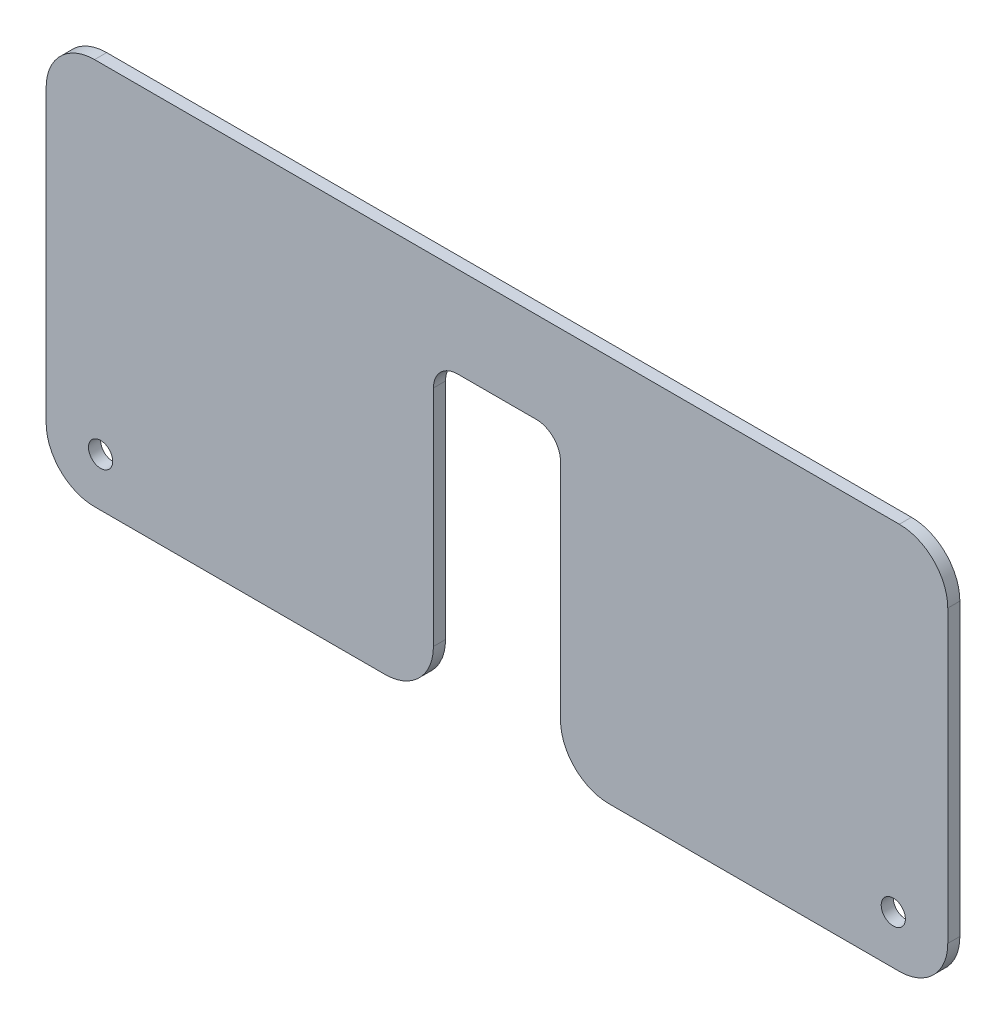
ISO-10303-21;
HEADER;
FILE_DESCRIPTION(('STEP AP214'),'2;1');
FILE_NAME('part.step','',(''),(''),'','','');
FILE_SCHEMA(('AUTOMOTIVE_DESIGN { 1 0 10303 214 1 1 1 1 }'));
ENDSEC;
DATA;
#1=APPLICATION_CONTEXT('core data for automotive mechanical design processes');
#2=APPLICATION_PROTOCOL_DEFINITION('international standard','automotive_design',2000,#1);
#3=PRODUCT_CONTEXT('',#1,'mechanical');
#4=PRODUCT('Part','Part','',(#3));
#5=PRODUCT_RELATED_PRODUCT_CATEGORY('part','',(#4));
#6=PRODUCT_DEFINITION_FORMATION('','',#4);
#7=PRODUCT_DEFINITION_CONTEXT('part definition',#1,'design');
#8=PRODUCT_DEFINITION('design','',#6,#7);
#9=PRODUCT_DEFINITION_SHAPE('','',#8);
#10=(LENGTH_UNIT() NAMED_UNIT(*) SI_UNIT(.MILLI.,.METRE.));
#11=(NAMED_UNIT(*) PLANE_ANGLE_UNIT() SI_UNIT($,.RADIAN.));
#12=(NAMED_UNIT(*) SI_UNIT($,.STERADIAN.) SOLID_ANGLE_UNIT());
#13=UNCERTAINTY_MEASURE_WITH_UNIT(LENGTH_MEASURE(1.E-05),#10,'distance_accuracy_value','');
#14=(GEOMETRIC_REPRESENTATION_CONTEXT(3) GLOBAL_UNCERTAINTY_ASSIGNED_CONTEXT((#13)) GLOBAL_UNIT_ASSIGNED_CONTEXT((#10,
#11,#12)) REPRESENTATION_CONTEXT('',''));
#15=CARTESIAN_POINT('',(0.,0.,0.));
#16=DIRECTION('',(0.,0.,1.));
#17=DIRECTION('',(1.,0.,0.));
#18=AXIS2_PLACEMENT_3D('',#15,#16,#17);
#19=CARTESIAN_POINT('',(-66.5,-8.00000000000001,2.));
#20=DIRECTION('',(0.,0.,1.));
#21=DIRECTION('',(1.,0.,0.));
#22=AXIS2_PLACEMENT_3D('',#19,#20,#21);
#23=PLANE('',#22);
#24=CARTESIAN_POINT('',(-65.5,-56.,2.));
#25=DIRECTION('',(0.,0.,1.));
#26=DIRECTION('',(1.,0.,0.));
#27=AXIS2_PLACEMENT_3D('',#24,#25,#26);
#28=CIRCLE('',#27,2.);
#29=CARTESIAN_POINT('',(-63.5,-56.,2.));
#30=VERTEX_POINT('',#29);
#31=EDGE_CURVE('E182',#30,#30,#28,.T.);
#32=ORIENTED_EDGE('',*,*,#31,.F.);
#33=EDGE_LOOP('',(#32));
#34=FACE_BOUND('',#33,.T.);
#35=DIRECTION('',(-1.,0.,0.));
#36=VECTOR('',#35,1.);
#37=CARTESIAN_POINT('',(66.5,0.,2.));
#38=LINE('',#37,#36);
#39=CARTESIAN_POINT('',(66.5,0.,2.));
#40=VERTEX_POINT('',#39);
#41=CARTESIAN_POINT('',(-66.5,0.,2.));
#42=VERTEX_POINT('',#41);
#43=EDGE_CURVE('E118',#40,#42,#38,.T.);
#44=ORIENTED_EDGE('',*,*,#43,.T.);
#45=CARTESIAN_POINT('',(-66.5,-8.00000000000001,2.));
#46=DIRECTION('',(0.,0.,1.));
#47=DIRECTION('',(1.,0.,0.));
#48=AXIS2_PLACEMENT_3D('',#45,#46,#47);
#49=CIRCLE('',#48,8.);
#50=CARTESIAN_POINT('',(-74.5,-8.00000000000001,2.));
#51=VERTEX_POINT('',#50);
#52=EDGE_CURVE('E300',#42,#51,#49,.T.);
#53=ORIENTED_EDGE('',*,*,#52,.T.);
#54=DIRECTION('',(0.,-1.,0.));
#55=VECTOR('',#54,1.);
#56=CARTESIAN_POINT('',(-74.5,-8.00000000000001,2.));
#57=LINE('',#56,#55);
#58=CARTESIAN_POINT('',(-74.5,-56.,2.));
#59=VERTEX_POINT('',#58);
#60=EDGE_CURVE('E251',#51,#59,#57,.T.);
#61=ORIENTED_EDGE('',*,*,#60,.T.);
#62=CARTESIAN_POINT('',(-66.5,-56.,2.));
#63=DIRECTION('',(0.,0.,1.));
#64=DIRECTION('',(1.,0.,0.));
#65=AXIS2_PLACEMENT_3D('',#62,#63,#64);
#66=CIRCLE('',#65,8.);
#67=CARTESIAN_POINT('',(-66.5,-64.,2.));
#68=VERTEX_POINT('',#67);
#69=EDGE_CURVE('E270',#59,#68,#66,.T.);
#70=ORIENTED_EDGE('',*,*,#69,.T.);
#71=DIRECTION('',(1.,0.,0.));
#72=VECTOR('',#71,1.);
#73=CARTESIAN_POINT('',(-66.5,-64.,2.));
#74=LINE('',#73,#72);
#75=CARTESIAN_POINT('',(-18.5,-64.,2.));
#76=VERTEX_POINT('',#75);
#77=EDGE_CURVE('E267',#68,#76,#74,.T.);
#78=ORIENTED_EDGE('',*,*,#77,.T.);
#79=CARTESIAN_POINT('',(-18.5,-56.,2.));
#80=DIRECTION('',(0.,0.,1.));
#81=DIRECTION('',(1.,0.,0.));
#82=AXIS2_PLACEMENT_3D('',#79,#80,#81);
#83=CIRCLE('',#82,8.);
#84=CARTESIAN_POINT('',(-10.5,-56.,2.));
#85=VERTEX_POINT('',#84);
#86=EDGE_CURVE('E269',#76,#85,#83,.T.);
#87=ORIENTED_EDGE('',*,*,#86,.T.);
#88=DIRECTION('',(0.,1.,0.));
#89=VECTOR('',#88,1.);
#90=CARTESIAN_POINT('',(-10.5,-56.,2.));
#91=LINE('',#90,#89);
#92=CARTESIAN_POINT('',(-10.5,-19.,2.));
#93=VERTEX_POINT('',#92);
#94=EDGE_CURVE('E272',#85,#93,#91,.T.);
#95=ORIENTED_EDGE('',*,*,#94,.T.);
#96=CARTESIAN_POINT('',(-6.5,-19.,2.));
#97=DIRECTION('',(0.,0.,-1.));
#98=DIRECTION('',(-1.,0.,0.));
#99=AXIS2_PLACEMENT_3D('',#96,#97,#98);
#100=CIRCLE('',#99,4.);
#101=CARTESIAN_POINT('',(-6.5,-15.,2.));
#102=VERTEX_POINT('',#101);
#103=EDGE_CURVE('E278',#93,#102,#100,.T.);
#104=ORIENTED_EDGE('',*,*,#103,.T.);
#105=DIRECTION('',(1.,0.,0.));
#106=VECTOR('',#105,1.);
#107=CARTESIAN_POINT('',(-6.5,-15.,2.));
#108=LINE('',#107,#106);
#109=CARTESIAN_POINT('',(6.5,-15.,2.));
#110=VERTEX_POINT('',#109);
#111=EDGE_CURVE('E280',#102,#110,#108,.T.);
#112=ORIENTED_EDGE('',*,*,#111,.T.);
#113=CARTESIAN_POINT('',(6.5,-19.,2.));
#114=DIRECTION('',(0.,0.,-1.));
#115=DIRECTION('',(-1.,0.,0.));
#116=AXIS2_PLACEMENT_3D('',#113,#114,#115);
#117=CIRCLE('',#116,4.);
#118=CARTESIAN_POINT('',(10.5,-19.,2.));
#119=VERTEX_POINT('',#118);
#120=EDGE_CURVE('E282',#110,#119,#117,.T.);
#121=ORIENTED_EDGE('',*,*,#120,.T.);
#122=DIRECTION('',(0.,-1.,0.));
#123=VECTOR('',#122,1.);
#124=CARTESIAN_POINT('',(10.5,-19.,2.));
#125=LINE('',#124,#123);
#126=CARTESIAN_POINT('',(10.5,-56.,2.));
#127=VERTEX_POINT('',#126);
#128=EDGE_CURVE('E284',#119,#127,#125,.T.);
#129=ORIENTED_EDGE('',*,*,#128,.T.);
#130=CARTESIAN_POINT('',(18.5,-56.,2.));
#131=DIRECTION('',(0.,0.,1.));
#132=DIRECTION('',(1.,0.,0.));
#133=AXIS2_PLACEMENT_3D('',#130,#131,#132);
#134=CIRCLE('',#133,8.);
#135=CARTESIAN_POINT('',(18.5,-64.,2.));
#136=VERTEX_POINT('',#135);
#137=EDGE_CURVE('E286',#127,#136,#134,.T.);
#138=ORIENTED_EDGE('',*,*,#137,.T.);
#139=DIRECTION('',(1.,0.,0.));
#140=VECTOR('',#139,1.);
#141=CARTESIAN_POINT('',(18.5,-64.,2.));
#142=LINE('',#141,#140);
#143=CARTESIAN_POINT('',(66.5,-64.,2.));
#144=VERTEX_POINT('',#143);
#145=EDGE_CURVE('E162',#136,#144,#142,.T.);
#146=ORIENTED_EDGE('',*,*,#145,.T.);
#147=CARTESIAN_POINT('',(66.5,-56.,2.));
#148=DIRECTION('',(0.,0.,1.));
#149=DIRECTION('',(1.,0.,0.));
#150=AXIS2_PLACEMENT_3D('',#147,#148,#149);
#151=CIRCLE('',#150,8.);
#152=CARTESIAN_POINT('',(74.5,-56.,2.));
#153=VERTEX_POINT('',#152);
#154=EDGE_CURVE('E156',#144,#153,#151,.T.);
#155=ORIENTED_EDGE('',*,*,#154,.T.);
#156=DIRECTION('',(0.,1.,0.));
#157=VECTOR('',#156,1.);
#158=CARTESIAN_POINT('',(74.5,-56.,2.));
#159=LINE('',#158,#157);
#160=CARTESIAN_POINT('',(74.5,-8.,2.));
#161=VERTEX_POINT('',#160);
#162=EDGE_CURVE('E160',#153,#161,#159,.T.);
#163=ORIENTED_EDGE('',*,*,#162,.T.);
#164=CARTESIAN_POINT('',(66.5,-8.,2.));
#165=DIRECTION('',(0.,0.,1.));
#166=DIRECTION('',(1.,0.,0.));
#167=AXIS2_PLACEMENT_3D('',#164,#165,#166);
#168=CIRCLE('',#167,8.);
#169=EDGE_CURVE('E52',#161,#40,#168,.T.);
#170=ORIENTED_EDGE('',*,*,#169,.T.);
#171=EDGE_LOOP('',(#44,#53,#61,#70,#78,#87,#95,#104,#112,#121,#129,#138,#146,#155,#163,#170));
#172=FACE_BOUND('',#171,.T.);
#173=CARTESIAN_POINT('',(65.5,-56.,2.));
#174=DIRECTION('',(0.,0.,1.));
#175=DIRECTION('',(-1.,0.,0.));
#176=AXIS2_PLACEMENT_3D('',#173,#174,#175);
#177=CIRCLE('',#176,1.99999999999998);
#178=CARTESIAN_POINT('',(63.5,-56.,2.));
#179=VERTEX_POINT('',#178);
#180=EDGE_CURVE('E492',#179,#179,#177,.T.);
#181=ORIENTED_EDGE('',*,*,#180,.F.);
#182=EDGE_LOOP('',(#181));
#183=FACE_BOUND('',#182,.T.);
#184=ADVANCED_FACE('F35',(#34,#172,#183),#23,.T.);
#185=CARTESIAN_POINT('',(-66.5,-8.00000000000001,0.));
#186=DIRECTION('',(0.,0.,1.));
#187=DIRECTION('',(1.,0.,0.));
#188=AXIS2_PLACEMENT_3D('',#185,#186,#187);
#189=PLANE('',#188);
#190=DIRECTION('',(-1.,0.,0.));
#191=VECTOR('',#190,1.);
#192=CARTESIAN_POINT('',(0.,0.,0.));
#193=LINE('',#192,#191);
#194=CARTESIAN_POINT('',(66.5,0.,0.));
#195=VERTEX_POINT('',#194);
#196=CARTESIAN_POINT('',(-66.5,0.,0.));
#197=VERTEX_POINT('',#196);
#198=EDGE_CURVE('E112',#195,#197,#193,.T.);
#199=ORIENTED_EDGE('',*,*,#198,.F.);
#200=CARTESIAN_POINT('',(66.5,-8.,0.));
#201=DIRECTION('',(0.,0.,1.));
#202=DIRECTION('',(1.,0.,0.));
#203=AXIS2_PLACEMENT_3D('',#200,#201,#202);
#204=CIRCLE('',#203,8.);
#205=CARTESIAN_POINT('',(74.5,-8.,0.));
#206=VERTEX_POINT('',#205);
#207=EDGE_CURVE('E209',#206,#195,#204,.T.);
#208=ORIENTED_EDGE('',*,*,#207,.F.);
#209=DIRECTION('',(0.,1.,0.));
#210=VECTOR('',#209,1.);
#211=CARTESIAN_POINT('',(74.5,-56.,0.));
#212=LINE('',#211,#210);
#213=CARTESIAN_POINT('',(74.5,-56.,0.));
#214=VERTEX_POINT('',#213);
#215=EDGE_CURVE('E105',#214,#206,#212,.T.);
#216=ORIENTED_EDGE('',*,*,#215,.F.);
#217=CARTESIAN_POINT('',(66.5,-56.,0.));
#218=DIRECTION('',(0.,0.,1.));
#219=DIRECTION('',(1.,0.,0.));
#220=AXIS2_PLACEMENT_3D('',#217,#218,#219);
#221=CIRCLE('',#220,8.);
#222=CARTESIAN_POINT('',(66.5,-64.,0.));
#223=VERTEX_POINT('',#222);
#224=EDGE_CURVE('E170',#223,#214,#221,.T.);
#225=ORIENTED_EDGE('',*,*,#224,.F.);
#226=DIRECTION('',(1.,0.,0.));
#227=VECTOR('',#226,1.);
#228=CARTESIAN_POINT('',(18.5,-64.,0.));
#229=LINE('',#228,#227);
#230=CARTESIAN_POINT('',(18.5,-64.,0.));
#231=VERTEX_POINT('',#230);
#232=EDGE_CURVE('E205',#231,#223,#229,.T.);
#233=ORIENTED_EDGE('',*,*,#232,.F.);
#234=CARTESIAN_POINT('',(18.5,-56.,0.));
#235=DIRECTION('',(0.,0.,1.));
#236=DIRECTION('',(1.,0.,0.));
#237=AXIS2_PLACEMENT_3D('',#234,#235,#236);
#238=CIRCLE('',#237,8.);
#239=CARTESIAN_POINT('',(10.5,-56.,0.));
#240=VERTEX_POINT('',#239);
#241=EDGE_CURVE('E203',#240,#231,#238,.T.);
#242=ORIENTED_EDGE('',*,*,#241,.F.);
#243=DIRECTION('',(0.,-1.,0.));
#244=VECTOR('',#243,1.);
#245=CARTESIAN_POINT('',(10.5,-19.,0.));
#246=LINE('',#245,#244);
#247=CARTESIAN_POINT('',(10.5,-19.,0.));
#248=VERTEX_POINT('',#247);
#249=EDGE_CURVE('E201',#248,#240,#246,.T.);
#250=ORIENTED_EDGE('',*,*,#249,.F.);
#251=CARTESIAN_POINT('',(6.5,-19.,0.));
#252=DIRECTION('',(0.,0.,-1.));
#253=DIRECTION('',(-1.,0.,0.));
#254=AXIS2_PLACEMENT_3D('',#251,#252,#253);
#255=CIRCLE('',#254,4.);
#256=CARTESIAN_POINT('',(6.5,-15.,0.));
#257=VERTEX_POINT('',#256);
#258=EDGE_CURVE('E199',#257,#248,#255,.T.);
#259=ORIENTED_EDGE('',*,*,#258,.F.);
#260=DIRECTION('',(1.,0.,0.));
#261=VECTOR('',#260,1.);
#262=CARTESIAN_POINT('',(0.,-15.,0.));
#263=LINE('',#262,#261);
#264=CARTESIAN_POINT('',(-6.5,-15.,0.));
#265=VERTEX_POINT('',#264);
#266=EDGE_CURVE('E197',#265,#257,#263,.T.);
#267=ORIENTED_EDGE('',*,*,#266,.F.);
#268=CARTESIAN_POINT('',(-6.5,-19.,0.));
#269=DIRECTION('',(0.,0.,-1.));
#270=DIRECTION('',(-1.,0.,0.));
#271=AXIS2_PLACEMENT_3D('',#268,#269,#270);
#272=CIRCLE('',#271,4.);
#273=CARTESIAN_POINT('',(-10.5,-19.,0.));
#274=VERTEX_POINT('',#273);
#275=EDGE_CURVE('E194',#274,#265,#272,.T.);
#276=ORIENTED_EDGE('',*,*,#275,.F.);
#277=DIRECTION('',(0.,1.,0.));
#278=VECTOR('',#277,1.);
#279=CARTESIAN_POINT('',(-10.5,-56.,0.));
#280=LINE('',#279,#278);
#281=CARTESIAN_POINT('',(-10.5,-56.,0.));
#282=VERTEX_POINT('',#281);
#283=EDGE_CURVE('E192',#282,#274,#280,.T.);
#284=ORIENTED_EDGE('',*,*,#283,.F.);
#285=CARTESIAN_POINT('',(-18.5,-56.,0.));
#286=DIRECTION('',(0.,0.,1.));
#287=DIRECTION('',(1.,0.,0.));
#288=AXIS2_PLACEMENT_3D('',#285,#286,#287);
#289=CIRCLE('',#288,8.);
#290=CARTESIAN_POINT('',(-18.5,-64.,0.));
#291=VERTEX_POINT('',#290);
#292=EDGE_CURVE('E190',#291,#282,#289,.T.);
#293=ORIENTED_EDGE('',*,*,#292,.F.);
#294=DIRECTION('',(1.,0.,0.));
#295=VECTOR('',#294,1.);
#296=CARTESIAN_POINT('',(-66.5,-64.,0.));
#297=LINE('',#296,#295);
#298=CARTESIAN_POINT('',(-66.5,-64.,0.));
#299=VERTEX_POINT('',#298);
#300=EDGE_CURVE('E188',#299,#291,#297,.T.);
#301=ORIENTED_EDGE('',*,*,#300,.F.);
#302=CARTESIAN_POINT('',(-66.5,-56.,0.));
#303=DIRECTION('',(0.,0.,1.));
#304=DIRECTION('',(1.,0.,0.));
#305=AXIS2_PLACEMENT_3D('',#302,#303,#304);
#306=CIRCLE('',#305,8.);
#307=CARTESIAN_POINT('',(-74.5,-56.,0.));
#308=VERTEX_POINT('',#307);
#309=EDGE_CURVE('E186',#308,#299,#306,.T.);
#310=ORIENTED_EDGE('',*,*,#309,.F.);
#311=DIRECTION('',(0.,-1.,0.));
#312=VECTOR('',#311,1.);
#313=CARTESIAN_POINT('',(-74.5,-8.00000000000001,0.));
#314=LINE('',#313,#312);
#315=CARTESIAN_POINT('',(-74.5,-8.00000000000001,0.));
#316=VERTEX_POINT('',#315);
#317=EDGE_CURVE('E184',#316,#308,#314,.T.);
#318=ORIENTED_EDGE('',*,*,#317,.F.);
#319=CARTESIAN_POINT('',(-66.5,-8.00000000000001,0.));
#320=DIRECTION('',(0.,0.,1.));
#321=DIRECTION('',(1.,0.,0.));
#322=AXIS2_PLACEMENT_3D('',#319,#320,#321);
#323=CIRCLE('',#322,8.);
#324=EDGE_CURVE('E181',#197,#316,#323,.T.);
#325=ORIENTED_EDGE('',*,*,#324,.F.);
#326=EDGE_LOOP('',(#199,#208,#216,#225,#233,#242,#250,#259,#267,#276,#284,#293,#301,#310,#318,#325));
#327=FACE_BOUND('',#326,.T.);
#328=CARTESIAN_POINT('',(-65.5,-56.,0.));
#329=DIRECTION('',(0.,0.,1.));
#330=DIRECTION('',(1.,0.,0.));
#331=AXIS2_PLACEMENT_3D('',#328,#329,#330);
#332=CIRCLE('',#331,2.);
#333=CARTESIAN_POINT('',(-63.5,-56.,0.));
#334=VERTEX_POINT('',#333);
#335=EDGE_CURVE('E304',#334,#334,#332,.T.);
#336=ORIENTED_EDGE('',*,*,#335,.T.);
#337=EDGE_LOOP('',(#336));
#338=FACE_BOUND('',#337,.T.);
#339=CARTESIAN_POINT('',(65.5,-56.,0.));
#340=DIRECTION('',(0.,0.,1.));
#341=DIRECTION('',(-1.,0.,0.));
#342=AXIS2_PLACEMENT_3D('',#339,#340,#341);
#343=CIRCLE('',#342,1.99999999999998);
#344=CARTESIAN_POINT('',(63.5,-56.,0.));
#345=VERTEX_POINT('',#344);
#346=EDGE_CURVE('E495',#345,#345,#343,.T.);
#347=ORIENTED_EDGE('',*,*,#346,.T.);
#348=EDGE_LOOP('',(#347));
#349=FACE_BOUND('',#348,.T.);
#350=ADVANCED_FACE('F255',(#327,#338,#349),#189,.F.);
#351=CARTESIAN_POINT('',(0.,0.,2.));
#352=DIRECTION('',(0.,-1.,0.));
#353=DIRECTION('',(1.,0.,0.));
#354=AXIS2_PLACEMENT_3D('',#351,#352,#353);
#355=PLANE('',#354);
#356=ORIENTED_EDGE('',*,*,#198,.T.);
#357=DIRECTION('',(0.,0.,-1.));
#358=VECTOR('',#357,1.);
#359=CARTESIAN_POINT('',(-66.5,0.,2.));
#360=LINE('',#359,#358);
#361=EDGE_CURVE('E11',#42,#197,#360,.T.);
#362=ORIENTED_EDGE('',*,*,#361,.F.);
#363=ORIENTED_EDGE('',*,*,#43,.F.);
#364=DIRECTION('',(0.,0.,-1.));
#365=VECTOR('',#364,1.);
#366=CARTESIAN_POINT('',(66.5,0.,2.));
#367=LINE('',#366,#365);
#368=EDGE_CURVE('E176',#40,#195,#367,.T.);
#369=ORIENTED_EDGE('',*,*,#368,.T.);
#370=EDGE_LOOP('',(#356,#362,#363,#369));
#371=FACE_BOUND('',#370,.T.);
#372=ADVANCED_FACE('F37',(#371),#355,.F.);
#373=CARTESIAN_POINT('',(-66.5,-8.00000000000001,2.));
#374=DIRECTION('',(0.,0.,-1.));
#375=DIRECTION('',(-1.,0.,0.));
#376=AXIS2_PLACEMENT_3D('',#373,#374,#375);
#377=CYLINDRICAL_SURFACE('',#376,8.);
#378=ORIENTED_EDGE('',*,*,#324,.T.);
#379=DIRECTION('',(0.,0.,-1.));
#380=VECTOR('',#379,1.);
#381=CARTESIAN_POINT('',(-74.5,-8.00000000000001,2.));
#382=LINE('',#381,#380);
#383=EDGE_CURVE('E44',#51,#316,#382,.T.);
#384=ORIENTED_EDGE('',*,*,#383,.F.);
#385=ORIENTED_EDGE('',*,*,#52,.F.);
#386=ORIENTED_EDGE('',*,*,#361,.T.);
#387=EDGE_LOOP('',(#378,#384,#385,#386));
#388=FACE_BOUND('',#387,.T.);
#389=ADVANCED_FACE('F306',(#388),#377,.T.);
#390=CARTESIAN_POINT('',(-74.5,-8.00000000000001,2.));
#391=DIRECTION('',(1.,0.,0.));
#392=DIRECTION('',(0.,0.,-1.));
#393=AXIS2_PLACEMENT_3D('',#390,#391,#392);
#394=PLANE('',#393);
#395=ORIENTED_EDGE('',*,*,#317,.T.);
#396=DIRECTION('',(0.,0.,-1.));
#397=VECTOR('',#396,1.);
#398=CARTESIAN_POINT('',(-74.5,-56.,2.));
#399=LINE('',#398,#397);
#400=EDGE_CURVE('E242',#59,#308,#399,.T.);
#401=ORIENTED_EDGE('',*,*,#400,.F.);
#402=ORIENTED_EDGE('',*,*,#60,.F.);
#403=ORIENTED_EDGE('',*,*,#383,.T.);
#404=EDGE_LOOP('',(#395,#401,#402,#403));
#405=FACE_BOUND('',#404,.T.);
#406=ADVANCED_FACE('F249',(#405),#394,.F.);
#407=CARTESIAN_POINT('',(-66.5,-56.,2.));
#408=DIRECTION('',(0.,0.,-1.));
#409=DIRECTION('',(-1.,0.,0.));
#410=AXIS2_PLACEMENT_3D('',#407,#408,#409);
#411=CYLINDRICAL_SURFACE('',#410,8.);
#412=ORIENTED_EDGE('',*,*,#309,.T.);
#413=DIRECTION('',(0.,0.,-1.));
#414=VECTOR('',#413,1.);
#415=CARTESIAN_POINT('',(-66.5,-64.,2.));
#416=LINE('',#415,#414);
#417=EDGE_CURVE('E239',#68,#299,#416,.T.);
#418=ORIENTED_EDGE('',*,*,#417,.F.);
#419=ORIENTED_EDGE('',*,*,#69,.F.);
#420=ORIENTED_EDGE('',*,*,#400,.T.);
#421=EDGE_LOOP('',(#412,#418,#419,#420));
#422=FACE_BOUND('',#421,.T.);
#423=ADVANCED_FACE('F261',(#422),#411,.T.);
#424=CARTESIAN_POINT('',(-66.5,-64.,2.));
#425=DIRECTION('',(0.,1.,0.));
#426=DIRECTION('',(0.,0.,1.));
#427=AXIS2_PLACEMENT_3D('',#424,#425,#426);
#428=PLANE('',#427);
#429=ORIENTED_EDGE('',*,*,#300,.T.);
#430=DIRECTION('',(0.,0.,-1.));
#431=VECTOR('',#430,1.);
#432=CARTESIAN_POINT('',(-18.5,-64.,2.));
#433=LINE('',#432,#431);
#434=EDGE_CURVE('E236',#76,#291,#433,.T.);
#435=ORIENTED_EDGE('',*,*,#434,.F.);
#436=ORIENTED_EDGE('',*,*,#77,.F.);
#437=ORIENTED_EDGE('',*,*,#417,.T.);
#438=EDGE_LOOP('',(#429,#435,#436,#437));
#439=FACE_BOUND('',#438,.T.);
#440=ADVANCED_FACE('F265',(#439),#428,.F.);
#441=CARTESIAN_POINT('',(-18.5,-56.,2.));
#442=DIRECTION('',(0.,0.,-1.));
#443=DIRECTION('',(-1.,0.,0.));
#444=AXIS2_PLACEMENT_3D('',#441,#442,#443);
#445=CYLINDRICAL_SURFACE('',#444,8.);
#446=ORIENTED_EDGE('',*,*,#292,.T.);
#447=DIRECTION('',(0.,0.,-1.));
#448=VECTOR('',#447,1.);
#449=CARTESIAN_POINT('',(-10.5,-56.,2.));
#450=LINE('',#449,#448);
#451=EDGE_CURVE('E233',#85,#282,#450,.T.);
#452=ORIENTED_EDGE('',*,*,#451,.F.);
#453=ORIENTED_EDGE('',*,*,#86,.F.);
#454=ORIENTED_EDGE('',*,*,#434,.T.);
#455=EDGE_LOOP('',(#446,#452,#453,#454));
#456=FACE_BOUND('',#455,.T.);
#457=ADVANCED_FACE('F354',(#456),#445,.T.);
#458=CARTESIAN_POINT('',(-10.5,-56.,2.));
#459=DIRECTION('',(-1.,0.,0.));
#460=DIRECTION('',(0.,-1.,0.));
#461=AXIS2_PLACEMENT_3D('',#458,#459,#460);
#462=PLANE('',#461);
#463=ORIENTED_EDGE('',*,*,#283,.T.);
#464=DIRECTION('',(0.,0.,-1.));
#465=VECTOR('',#464,1.);
#466=CARTESIAN_POINT('',(-10.5,-19.,2.));
#467=LINE('',#466,#465);
#468=EDGE_CURVE('E230',#93,#274,#467,.T.);
#469=ORIENTED_EDGE('',*,*,#468,.F.);
#470=ORIENTED_EDGE('',*,*,#94,.F.);
#471=ORIENTED_EDGE('',*,*,#451,.T.);
#472=EDGE_LOOP('',(#463,#469,#470,#471));
#473=FACE_BOUND('',#472,.T.);
#474=ADVANCED_FACE('F350',(#473),#462,.F.);
#475=CARTESIAN_POINT('',(-6.5,-19.,2.));
#476=DIRECTION('',(0.,0.,-1.));
#477=DIRECTION('',(-1.,0.,0.));
#478=AXIS2_PLACEMENT_3D('',#475,#476,#477);
#479=CYLINDRICAL_SURFACE('',#478,4.);
#480=ORIENTED_EDGE('',*,*,#275,.T.);
#481=DIRECTION('',(0.,0.,-1.));
#482=VECTOR('',#481,1.);
#483=CARTESIAN_POINT('',(-6.5,-15.,2.));
#484=LINE('',#483,#482);
#485=EDGE_CURVE('E227',#102,#265,#484,.T.);
#486=ORIENTED_EDGE('',*,*,#485,.F.);
#487=ORIENTED_EDGE('',*,*,#103,.F.);
#488=ORIENTED_EDGE('',*,*,#468,.T.);
#489=EDGE_LOOP('',(#480,#486,#487,#488));
#490=FACE_BOUND('',#489,.T.);
#491=ADVANCED_FACE('F346',(#490),#479,.F.);
#492=CARTESIAN_POINT('',(0.,-15.,2.));
#493=DIRECTION('',(0.,1.,0.));
#494=DIRECTION('',(0.,0.,1.));
#495=AXIS2_PLACEMENT_3D('',#492,#493,#494);
#496=PLANE('',#495);
#497=ORIENTED_EDGE('',*,*,#266,.T.);
#498=DIRECTION('',(0.,0.,-1.));
#499=VECTOR('',#498,1.);
#500=CARTESIAN_POINT('',(6.5,-15.,2.));
#501=LINE('',#500,#499);
#502=EDGE_CURVE('E224',#110,#257,#501,.T.);
#503=ORIENTED_EDGE('',*,*,#502,.F.);
#504=ORIENTED_EDGE('',*,*,#111,.F.);
#505=ORIENTED_EDGE('',*,*,#485,.T.);
#506=EDGE_LOOP('',(#497,#503,#504,#505));
#507=FACE_BOUND('',#506,.T.);
#508=ADVANCED_FACE('F342',(#507),#496,.F.);
#509=CARTESIAN_POINT('',(6.5,-19.,2.));
#510=DIRECTION('',(0.,0.,-1.));
#511=DIRECTION('',(-1.,0.,0.));
#512=AXIS2_PLACEMENT_3D('',#509,#510,#511);
#513=CYLINDRICAL_SURFACE('',#512,4.);
#514=ORIENTED_EDGE('',*,*,#258,.T.);
#515=DIRECTION('',(0.,0.,-1.));
#516=VECTOR('',#515,1.);
#517=CARTESIAN_POINT('',(10.5,-19.,2.));
#518=LINE('',#517,#516);
#519=EDGE_CURVE('E221',#119,#248,#518,.T.);
#520=ORIENTED_EDGE('',*,*,#519,.F.);
#521=ORIENTED_EDGE('',*,*,#120,.F.);
#522=ORIENTED_EDGE('',*,*,#502,.T.);
#523=EDGE_LOOP('',(#514,#520,#521,#522));
#524=FACE_BOUND('',#523,.T.);
#525=ADVANCED_FACE('F338',(#524),#513,.F.);
#526=CARTESIAN_POINT('',(10.5,-19.,2.));
#527=DIRECTION('',(1.,0.,0.));
#528=DIRECTION('',(0.,1.,0.));
#529=AXIS2_PLACEMENT_3D('',#526,#527,#528);
#530=PLANE('',#529);
#531=ORIENTED_EDGE('',*,*,#249,.T.);
#532=DIRECTION('',(0.,0.,-1.));
#533=VECTOR('',#532,1.);
#534=CARTESIAN_POINT('',(10.5,-56.,2.));
#535=LINE('',#534,#533);
#536=EDGE_CURVE('E218',#127,#240,#535,.T.);
#537=ORIENTED_EDGE('',*,*,#536,.F.);
#538=ORIENTED_EDGE('',*,*,#128,.F.);
#539=ORIENTED_EDGE('',*,*,#519,.T.);
#540=EDGE_LOOP('',(#531,#537,#538,#539));
#541=FACE_BOUND('',#540,.T.);
#542=ADVANCED_FACE('F335',(#541),#530,.F.);
#543=CARTESIAN_POINT('',(18.5,-56.,2.));
#544=DIRECTION('',(0.,0.,-1.));
#545=DIRECTION('',(-1.,0.,0.));
#546=AXIS2_PLACEMENT_3D('',#543,#544,#545);
#547=CYLINDRICAL_SURFACE('',#546,8.);
#548=ORIENTED_EDGE('',*,*,#241,.T.);
#549=DIRECTION('',(0.,0.,-1.));
#550=VECTOR('',#549,1.);
#551=CARTESIAN_POINT('',(18.5,-64.,2.));
#552=LINE('',#551,#550);
#553=EDGE_CURVE('E215',#136,#231,#552,.T.);
#554=ORIENTED_EDGE('',*,*,#553,.F.);
#555=ORIENTED_EDGE('',*,*,#137,.F.);
#556=ORIENTED_EDGE('',*,*,#536,.T.);
#557=EDGE_LOOP('',(#548,#554,#555,#556));
#558=FACE_BOUND('',#557,.T.);
#559=ADVANCED_FACE('F292',(#558),#547,.T.);
#560=CARTESIAN_POINT('',(18.5,-64.,2.));
#561=DIRECTION('',(0.,1.,0.));
#562=DIRECTION('',(0.,0.,1.));
#563=AXIS2_PLACEMENT_3D('',#560,#561,#562);
#564=PLANE('',#563);
#565=ORIENTED_EDGE('',*,*,#232,.T.);
#566=DIRECTION('',(0.,0.,-1.));
#567=VECTOR('',#566,1.);
#568=CARTESIAN_POINT('',(66.5,-64.,2.));
#569=LINE('',#568,#567);
#570=EDGE_CURVE('E171',#144,#223,#569,.T.);
#571=ORIENTED_EDGE('',*,*,#570,.F.);
#572=ORIENTED_EDGE('',*,*,#145,.F.);
#573=ORIENTED_EDGE('',*,*,#553,.T.);
#574=EDGE_LOOP('',(#565,#571,#572,#573));
#575=FACE_BOUND('',#574,.T.);
#576=ADVANCED_FACE('F296',(#575),#564,.F.);
#577=CARTESIAN_POINT('',(66.5,-56.,2.));
#578=DIRECTION('',(0.,0.,-1.));
#579=DIRECTION('',(-1.,0.,0.));
#580=AXIS2_PLACEMENT_3D('',#577,#578,#579);
#581=CYLINDRICAL_SURFACE('',#580,8.);
#582=ORIENTED_EDGE('',*,*,#224,.T.);
#583=DIRECTION('',(0.,0.,-1.));
#584=VECTOR('',#583,1.);
#585=CARTESIAN_POINT('',(74.5,-56.,2.));
#586=LINE('',#585,#584);
#587=EDGE_CURVE('E167',#153,#214,#586,.T.);
#588=ORIENTED_EDGE('',*,*,#587,.F.);
#589=ORIENTED_EDGE('',*,*,#154,.F.);
#590=ORIENTED_EDGE('',*,*,#570,.T.);
#591=EDGE_LOOP('',(#582,#588,#589,#590));
#592=FACE_BOUND('',#591,.T.);
#593=ADVANCED_FACE('F168',(#592),#581,.T.);
#594=CARTESIAN_POINT('',(74.5,-56.,2.));
#595=DIRECTION('',(-1.,0.,0.));
#596=DIRECTION('',(0.,0.,1.));
#597=AXIS2_PLACEMENT_3D('',#594,#595,#596);
#598=PLANE('',#597);
#599=ORIENTED_EDGE('',*,*,#215,.T.);
#600=DIRECTION('',(0.,0.,-1.));
#601=VECTOR('',#600,1.);
#602=CARTESIAN_POINT('',(74.5,-8.,2.));
#603=LINE('',#602,#601);
#604=EDGE_CURVE('E172',#161,#206,#603,.T.);
#605=ORIENTED_EDGE('',*,*,#604,.F.);
#606=ORIENTED_EDGE('',*,*,#162,.F.);
#607=ORIENTED_EDGE('',*,*,#587,.T.);
#608=EDGE_LOOP('',(#599,#605,#606,#607));
#609=FACE_BOUND('',#608,.T.);
#610=ADVANCED_FACE('F174',(#609),#598,.F.);
#611=CARTESIAN_POINT('',(66.5,-8.,2.));
#612=DIRECTION('',(0.,0.,-1.));
#613=DIRECTION('',(-1.,0.,0.));
#614=AXIS2_PLACEMENT_3D('',#611,#612,#613);
#615=CYLINDRICAL_SURFACE('',#614,8.);
#616=ORIENTED_EDGE('',*,*,#207,.T.);
#617=ORIENTED_EDGE('',*,*,#368,.F.);
#618=ORIENTED_EDGE('',*,*,#169,.F.);
#619=ORIENTED_EDGE('',*,*,#604,.T.);
#620=EDGE_LOOP('',(#616,#617,#618,#619));
#621=FACE_BOUND('',#620,.T.);
#622=ADVANCED_FACE('F298',(#621),#615,.T.);
#623=CARTESIAN_POINT('',(-65.5,-56.,2.));
#624=DIRECTION('',(0.,0.,-1.));
#625=DIRECTION('',(-1.,0.,0.));
#626=AXIS2_PLACEMENT_3D('',#623,#624,#625);
#627=CYLINDRICAL_SURFACE('',#626,2.);
#628=ORIENTED_EDGE('',*,*,#31,.T.);
#629=EDGE_LOOP('',(#628));
#630=FACE_BOUND('',#629,.T.);
#631=ORIENTED_EDGE('',*,*,#335,.F.);
#632=EDGE_LOOP('',(#631));
#633=FACE_BOUND('',#632,.T.);
#634=ADVANCED_FACE('F322',(#630,#633),#627,.F.);
#635=CARTESIAN_POINT('',(65.5,-56.,2.));
#636=DIRECTION('',(0.,0.,-1.));
#637=DIRECTION('',(-1.,0.,0.));
#638=AXIS2_PLACEMENT_3D('',#635,#636,#637);
#639=CYLINDRICAL_SURFACE('',#638,1.99999999999998);
#640=ORIENTED_EDGE('',*,*,#180,.T.);
#641=EDGE_LOOP('',(#640));
#642=FACE_BOUND('',#641,.T.);
#643=ORIENTED_EDGE('',*,*,#346,.F.);
#644=EDGE_LOOP('',(#643));
#645=FACE_BOUND('',#644,.T.);
#646=ADVANCED_FACE('F420',(#642,#645),#639,.F.);
#647=CLOSED_SHELL('',(#184,#350,#372,#389,#406,#423,#440,#457,#474,#491,#508,#525,#542,#559,
#576,#593,#610,#622,#634,#646));
#648=MANIFOLD_SOLID_BREP('B2',#647);
#649=ADVANCED_BREP_SHAPE_REPRESENTATION('',(#18,#648),#14);
#650=SHAPE_DEFINITION_REPRESENTATION(#9,#649);
ENDSEC;
END-ISO-10303-21;
